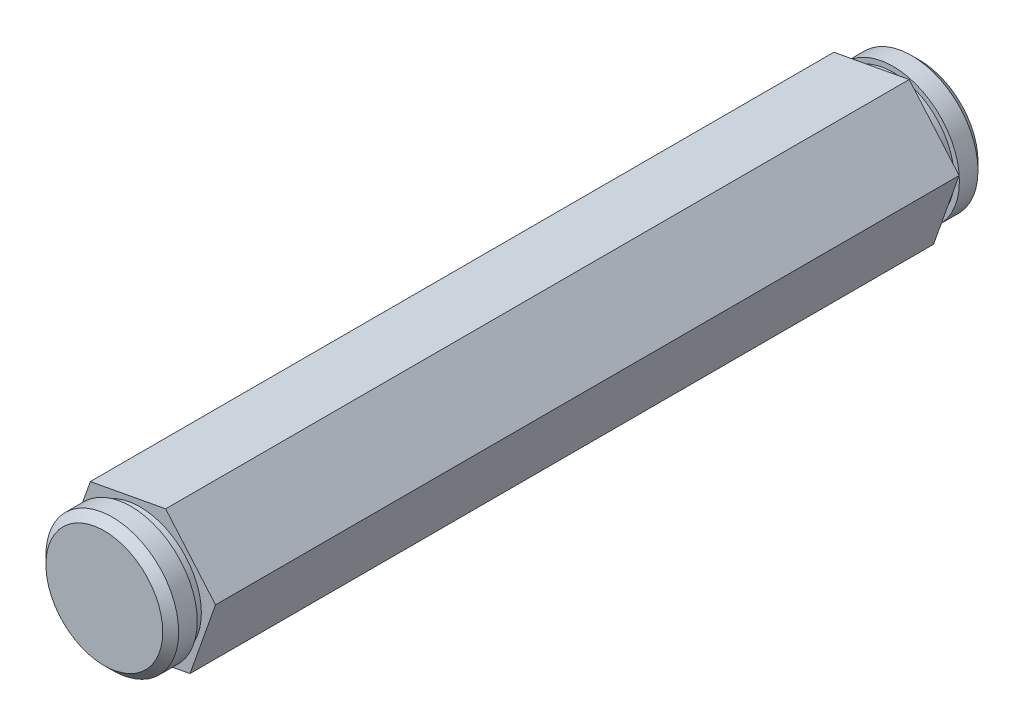
ISO-10303-21;
HEADER;
FILE_DESCRIPTION(('STEP AP214'),'2;1');
FILE_NAME('part.step','',(''),(''),'','','');
FILE_SCHEMA(('AUTOMOTIVE_DESIGN { 1 0 10303 214 1 1 1 1 }'));
ENDSEC;
DATA;
#1=APPLICATION_CONTEXT('core data for automotive mechanical design processes');
#2=APPLICATION_PROTOCOL_DEFINITION('international standard','automotive_design',2000,#1);
#3=PRODUCT_CONTEXT('',#1,'mechanical');
#4=PRODUCT('Part','Part','',(#3));
#5=PRODUCT_RELATED_PRODUCT_CATEGORY('part','',(#4));
#6=PRODUCT_DEFINITION_FORMATION('','',#4);
#7=PRODUCT_DEFINITION_CONTEXT('part definition',#1,'design');
#8=PRODUCT_DEFINITION('design','',#6,#7);
#9=PRODUCT_DEFINITION_SHAPE('','',#8);
#10=(LENGTH_UNIT() NAMED_UNIT(*) SI_UNIT(.MILLI.,.METRE.));
#11=(NAMED_UNIT(*) PLANE_ANGLE_UNIT() SI_UNIT($,.RADIAN.));
#12=(NAMED_UNIT(*) SI_UNIT($,.STERADIAN.) SOLID_ANGLE_UNIT());
#13=UNCERTAINTY_MEASURE_WITH_UNIT(LENGTH_MEASURE(1.E-05),#10,'distance_accuracy_value','');
#14=(GEOMETRIC_REPRESENTATION_CONTEXT(3) GLOBAL_UNCERTAINTY_ASSIGNED_CONTEXT((#13)) GLOBAL_UNIT_ASSIGNED_CONTEXT((#10,
#11,#12)) REPRESENTATION_CONTEXT('',''));
#15=CARTESIAN_POINT('',(0.,0.,0.));
#16=DIRECTION('',(0.,0.,1.));
#17=DIRECTION('',(1.,0.,0.));
#18=AXIS2_PLACEMENT_3D('',#15,#16,#17);
#19=CARTESIAN_POINT('',(0.,0.,35.56));
#20=DIRECTION('',(0.,0.,1.));
#21=DIRECTION('',(1.,0.,0.));
#22=AXIS2_PLACEMENT_3D('',#19,#20,#21);
#23=PLANE('',#22);
#24=DIRECTION('',(0.650243525538385,-0.759725843640593,0.));
#25=VECTOR('',#24,1.);
#26=CARTESIAN_POINT('',(-7.20816515024612,-1.3437590930338,35.56));
#27=LINE('',#26,#25);
#28=CARTESIAN_POINT('',(-7.20816515024612,-1.3437590930338,35.56));
#29=VERTEX_POINT('',#28);
#30=CARTESIAN_POINT('',(-2.44035306398947,-6.91433368130369,35.56));
#31=VERTEX_POINT('',#30);
#32=EDGE_CURVE('E130',#29,#31,#27,.T.);
#33=ORIENTED_EDGE('',*,*,#32,.T.);
#34=DIRECTION('',(0.983063643273511,0.183264489942301,0.));
#35=VECTOR('',#34,1.);
#36=CARTESIAN_POINT('',(-2.44035306398947,-6.91433368130369,35.56));
#37=LINE('',#36,#35);
#38=CARTESIAN_POINT('',(4.76781208625663,-5.57057458826989,35.56));
#39=VERTEX_POINT('',#38);
#40=EDGE_CURVE('E88',#31,#39,#37,.T.);
#41=ORIENTED_EDGE('',*,*,#40,.T.);
#42=DIRECTION('',(0.332820117735126,0.942990333582894,0.));
#43=VECTOR('',#42,1.);
#44=CARTESIAN_POINT('',(4.76781208625663,-5.57057458826989,35.56));
#45=LINE('',#44,#43);
#46=CARTESIAN_POINT('',(7.20816515024607,1.3437590930338,35.56));
#47=VERTEX_POINT('',#46);
#48=EDGE_CURVE('E101',#39,#47,#45,.T.);
#49=ORIENTED_EDGE('',*,*,#48,.T.);
#50=DIRECTION('',(-0.650243525538385,0.759725843640593,0.));
#51=VECTOR('',#50,1.);
#52=CARTESIAN_POINT('',(7.20816515024607,1.3437590930338,35.56));
#53=LINE('',#52,#51);
#54=CARTESIAN_POINT('',(2.44035306398941,6.9143336813037,35.56));
#55=VERTEX_POINT('',#54);
#56=EDGE_CURVE('E95',#47,#55,#53,.T.);
#57=ORIENTED_EDGE('',*,*,#56,.T.);
#58=DIRECTION('',(-0.983063643273511,-0.1832644899423,0.));
#59=VECTOR('',#58,1.);
#60=CARTESIAN_POINT('',(2.44035306398941,6.9143336813037,35.56));
#61=LINE('',#60,#59);
#62=CARTESIAN_POINT('',(-4.76781208625668,5.5705745882699,35.56));
#63=VERTEX_POINT('',#62);
#64=EDGE_CURVE('E99',#55,#63,#61,.T.);
#65=ORIENTED_EDGE('',*,*,#64,.T.);
#66=DIRECTION('',(-0.332820117735125,-0.942990333582894,0.));
#67=VECTOR('',#66,1.);
#68=CARTESIAN_POINT('',(-4.76781208625668,5.5705745882699,35.56));
#69=LINE('',#68,#67);
#70=EDGE_CURVE('E50',#63,#29,#69,.T.);
#71=ORIENTED_EDGE('',*,*,#70,.T.);
#72=EDGE_LOOP('',(#33,#41,#49,#57,#65,#71));
#73=FACE_BOUND('',#72,.T.);
#74=CARTESIAN_POINT('',(0.,0.,35.56));
#75=DIRECTION('',(0.,0.,1.));
#76=DIRECTION('',(1.,0.,0.));
#77=AXIS2_PLACEMENT_3D('',#74,#75,#76);
#78=CIRCLE('',#77,5.8547);
#79=CARTESIAN_POINT('',(5.8547,0.,35.56));
#80=VERTEX_POINT('',#79);
#81=EDGE_CURVE('E214',#80,#80,#78,.T.);
#82=ORIENTED_EDGE('',*,*,#81,.F.);
#83=EDGE_LOOP('',(#82));
#84=FACE_BOUND('',#83,.T.);
#85=ADVANCED_FACE('F33',(#73,#84),#23,.T.);
#86=CARTESIAN_POINT('',(-7.20816515024612,-1.3437590930338,35.56));
#87=DIRECTION('',(0.759725843640593,0.650243525538385,0.));
#88=DIRECTION('',(-0.650243525538385,0.759725843640593,0.));
#89=AXIS2_PLACEMENT_3D('',#86,#87,#88);
#90=PLANE('',#89);
#91=DIRECTION('',(0.650243525538385,-0.759725843640593,0.));
#92=VECTOR('',#91,1.);
#93=CARTESIAN_POINT('',(-7.20816515024612,-1.3437590930338,-35.56));
#94=LINE('',#93,#92);
#95=CARTESIAN_POINT('',(-7.20816515024612,-1.3437590930338,-35.56));
#96=VERTEX_POINT('',#95);
#97=CARTESIAN_POINT('',(-2.44035306398947,-6.91433368130369,-35.56));
#98=VERTEX_POINT('',#97);
#99=EDGE_CURVE('E119',#96,#98,#94,.T.);
#100=ORIENTED_EDGE('',*,*,#99,.T.);
#101=DIRECTION('',(0.,0.,-1.));
#102=VECTOR('',#101,1.);
#103=CARTESIAN_POINT('',(-2.44035306398947,-6.91433368130369,35.56));
#104=LINE('',#103,#102);
#105=EDGE_CURVE('E137',#31,#98,#104,.T.);
#106=ORIENTED_EDGE('',*,*,#105,.F.);
#107=ORIENTED_EDGE('',*,*,#32,.F.);
#108=DIRECTION('',(0.,0.,-1.));
#109=VECTOR('',#108,1.);
#110=CARTESIAN_POINT('',(-7.20816515024612,-1.3437590930338,35.56));
#111=LINE('',#110,#109);
#112=EDGE_CURVE('E115',#29,#96,#111,.T.);
#113=ORIENTED_EDGE('',*,*,#112,.T.);
#114=EDGE_LOOP('',(#100,#106,#107,#113));
#115=FACE_BOUND('',#114,.T.);
#116=ADVANCED_FACE('F161',(#115),#90,.F.);
#117=CARTESIAN_POINT('',(-2.44035306398947,-6.91433368130369,35.56));
#118=DIRECTION('',(-0.183264489942301,0.983063643273511,0.));
#119=DIRECTION('',(-0.983063643273511,-0.183264489942301,0.));
#120=AXIS2_PLACEMENT_3D('',#117,#118,#119);
#121=PLANE('',#120);
#122=DIRECTION('',(0.983063643273511,0.183264489942301,0.));
#123=VECTOR('',#122,1.);
#124=CARTESIAN_POINT('',(-2.44035306398947,-6.91433368130369,-35.56));
#125=LINE('',#124,#123);
#126=CARTESIAN_POINT('',(4.76781208625663,-5.57057458826989,-35.56));
#127=VERTEX_POINT('',#126);
#128=EDGE_CURVE('E122',#98,#127,#125,.T.);
#129=ORIENTED_EDGE('',*,*,#128,.T.);
#130=DIRECTION('',(0.,0.,-1.));
#131=VECTOR('',#130,1.);
#132=CARTESIAN_POINT('',(4.76781208625663,-5.57057458826989,35.56));
#133=LINE('',#132,#131);
#134=EDGE_CURVE('E134',#39,#127,#133,.T.);
#135=ORIENTED_EDGE('',*,*,#134,.F.);
#136=ORIENTED_EDGE('',*,*,#40,.F.);
#137=ORIENTED_EDGE('',*,*,#105,.T.);
#138=EDGE_LOOP('',(#129,#135,#136,#137));
#139=FACE_BOUND('',#138,.T.);
#140=ADVANCED_FACE('F166',(#139),#121,.F.);
#141=CARTESIAN_POINT('',(4.76781208625663,-5.57057458826989,35.56));
#142=DIRECTION('',(-0.942990333582893,0.332820117735126,0.));
#143=DIRECTION('',(-0.332820117735126,-0.942990333582894,0.));
#144=AXIS2_PLACEMENT_3D('',#141,#142,#143);
#145=PLANE('',#144);
#146=DIRECTION('',(0.332820117735126,0.942990333582894,0.));
#147=VECTOR('',#146,1.);
#148=CARTESIAN_POINT('',(4.76781208625663,-5.57057458826989,-35.56));
#149=LINE('',#148,#147);
#150=CARTESIAN_POINT('',(7.20816515024607,1.3437590930338,-35.56));
#151=VERTEX_POINT('',#150);
#152=EDGE_CURVE('E125',#127,#151,#149,.T.);
#153=ORIENTED_EDGE('',*,*,#152,.T.);
#154=DIRECTION('',(0.,0.,-1.));
#155=VECTOR('',#154,1.);
#156=CARTESIAN_POINT('',(7.20816515024607,1.3437590930338,35.56));
#157=LINE('',#156,#155);
#158=EDGE_CURVE('E110',#47,#151,#157,.T.);
#159=ORIENTED_EDGE('',*,*,#158,.F.);
#160=ORIENTED_EDGE('',*,*,#48,.F.);
#161=ORIENTED_EDGE('',*,*,#134,.T.);
#162=EDGE_LOOP('',(#153,#159,#160,#161));
#163=FACE_BOUND('',#162,.T.);
#164=ADVANCED_FACE('F184',(#163),#145,.F.);
#165=CARTESIAN_POINT('',(7.20816515024607,1.3437590930338,35.56));
#166=DIRECTION('',(-0.759725843640593,-0.650243525538385,0.));
#167=DIRECTION('',(0.650243525538385,-0.759725843640593,0.));
#168=AXIS2_PLACEMENT_3D('',#165,#166,#167);
#169=PLANE('',#168);
#170=DIRECTION('',(-0.650243525538385,0.759725843640593,0.));
#171=VECTOR('',#170,1.);
#172=CARTESIAN_POINT('',(7.20816515024607,1.3437590930338,-35.56));
#173=LINE('',#172,#171);
#174=CARTESIAN_POINT('',(2.44035306398941,6.9143336813037,-35.56));
#175=VERTEX_POINT('',#174);
#176=EDGE_CURVE('E109',#151,#175,#173,.T.);
#177=ORIENTED_EDGE('',*,*,#176,.T.);
#178=DIRECTION('',(0.,0.,-1.));
#179=VECTOR('',#178,1.);
#180=CARTESIAN_POINT('',(2.44035306398941,6.9143336813037,35.56));
#181=LINE('',#180,#179);
#182=EDGE_CURVE('E106',#55,#175,#181,.T.);
#183=ORIENTED_EDGE('',*,*,#182,.F.);
#184=ORIENTED_EDGE('',*,*,#56,.F.);
#185=ORIENTED_EDGE('',*,*,#158,.T.);
#186=EDGE_LOOP('',(#177,#183,#184,#185));
#187=FACE_BOUND('',#186,.T.);
#188=ADVANCED_FACE('F107',(#187),#169,.F.);
#189=CARTESIAN_POINT('',(2.44035306398941,6.9143336813037,35.56));
#190=DIRECTION('',(0.1832644899423,-0.983063643273511,0.));
#191=DIRECTION('',(0.983063643273511,0.1832644899423,0.));
#192=AXIS2_PLACEMENT_3D('',#189,#190,#191);
#193=PLANE('',#192);
#194=DIRECTION('',(-0.983063643273511,-0.1832644899423,0.));
#195=VECTOR('',#194,1.);
#196=CARTESIAN_POINT('',(2.44035306398941,6.9143336813037,-35.56));
#197=LINE('',#196,#195);
#198=CARTESIAN_POINT('',(-4.76781208625668,5.5705745882699,-35.56));
#199=VERTEX_POINT('',#198);
#200=EDGE_CURVE('E73',#175,#199,#197,.T.);
#201=ORIENTED_EDGE('',*,*,#200,.T.);
#202=DIRECTION('',(0.,0.,-1.));
#203=VECTOR('',#202,1.);
#204=CARTESIAN_POINT('',(-4.76781208625668,5.5705745882699,35.56));
#205=LINE('',#204,#203);
#206=EDGE_CURVE('E111',#63,#199,#205,.T.);
#207=ORIENTED_EDGE('',*,*,#206,.F.);
#208=ORIENTED_EDGE('',*,*,#64,.F.);
#209=ORIENTED_EDGE('',*,*,#182,.T.);
#210=EDGE_LOOP('',(#201,#207,#208,#209));
#211=FACE_BOUND('',#210,.T.);
#212=ADVANCED_FACE('F113',(#211),#193,.F.);
#213=CARTESIAN_POINT('',(-4.76781208625668,5.5705745882699,35.56));
#214=DIRECTION('',(0.942990333582894,-0.332820117735125,0.));
#215=DIRECTION('',(0.332820117735125,0.942990333582894,0.));
#216=AXIS2_PLACEMENT_3D('',#213,#214,#215);
#217=PLANE('',#216);
#218=DIRECTION('',(-0.332820117735125,-0.942990333582894,0.));
#219=VECTOR('',#218,1.);
#220=CARTESIAN_POINT('',(-4.76781208625668,5.5705745882699,-35.56));
#221=LINE('',#220,#219);
#222=EDGE_CURVE('E79',#199,#96,#221,.T.);
#223=ORIENTED_EDGE('',*,*,#222,.T.);
#224=ORIENTED_EDGE('',*,*,#112,.F.);
#225=ORIENTED_EDGE('',*,*,#70,.F.);
#226=ORIENTED_EDGE('',*,*,#206,.T.);
#227=EDGE_LOOP('',(#223,#224,#225,#226));
#228=FACE_BOUND('',#227,.T.);
#229=ADVANCED_FACE('F176',(#228),#217,.F.);
#230=CARTESIAN_POINT('',(0.,0.,-35.56));
#231=DIRECTION('',(0.,0.,1.));
#232=DIRECTION('',(1.,0.,0.));
#233=AXIS2_PLACEMENT_3D('',#230,#231,#232);
#234=PLANE('',#233);
#235=CARTESIAN_POINT('',(0.,0.,-35.56));
#236=DIRECTION('',(0.,0.,1.));
#237=DIRECTION('',(1.,0.,0.));
#238=AXIS2_PLACEMENT_3D('',#235,#236,#237);
#239=CIRCLE('',#238,5.8547);
#240=CARTESIAN_POINT('',(5.8547,0.,-35.56));
#241=VERTEX_POINT('',#240);
#242=EDGE_CURVE('E215',#241,#241,#239,.T.);
#243=ORIENTED_EDGE('',*,*,#242,.T.);
#244=EDGE_LOOP('',(#243));
#245=FACE_BOUND('',#244,.T.);
#246=ORIENTED_EDGE('',*,*,#99,.F.);
#247=ORIENTED_EDGE('',*,*,#222,.F.);
#248=ORIENTED_EDGE('',*,*,#200,.F.);
#249=ORIENTED_EDGE('',*,*,#176,.F.);
#250=ORIENTED_EDGE('',*,*,#152,.F.);
#251=ORIENTED_EDGE('',*,*,#128,.F.);
#252=EDGE_LOOP('',(#246,#247,#248,#249,#250,#251));
#253=FACE_BOUND('',#252,.T.);
#254=ADVANCED_FACE('F173',(#245,#253),#234,.F.);
#255=CARTESIAN_POINT('',(0.,0.,36.449));
#256=DIRECTION('',(0.,0.,-1.));
#257=DIRECTION('',(-1.,0.,0.));
#258=AXIS2_PLACEMENT_3D('',#255,#256,#257);
#259=CYLINDRICAL_SURFACE('',#258,5.8547);
#260=CARTESIAN_POINT('',(0.,0.,36.449));
#261=DIRECTION('',(0.,0.,1.));
#262=DIRECTION('',(1.,0.,0.));
#263=AXIS2_PLACEMENT_3D('',#260,#261,#262);
#264=CIRCLE('',#263,5.8547);
#265=CARTESIAN_POINT('',(5.8547,0.,36.449));
#266=VERTEX_POINT('',#265);
#267=EDGE_CURVE('E123',#266,#266,#264,.T.);
#268=ORIENTED_EDGE('',*,*,#267,.F.);
#269=EDGE_LOOP('',(#268));
#270=FACE_BOUND('',#269,.T.);
#271=ORIENTED_EDGE('',*,*,#81,.T.);
#272=EDGE_LOOP('',(#271));
#273=FACE_BOUND('',#272,.T.);
#274=ADVANCED_FACE('F171',(#270,#273),#259,.T.);
#275=CARTESIAN_POINT('',(0.,0.,36.449));
#276=DIRECTION('',(0.,0.,1.));
#277=DIRECTION('',(1.,0.,0.));
#278=AXIS2_PLACEMENT_3D('',#275,#276,#277);
#279=PLANE('',#278);
#280=CARTESIAN_POINT('',(0.,0.,36.449));
#281=DIRECTION('',(0.,0.,1.));
#282=DIRECTION('',(1.,0.,0.));
#283=AXIS2_PLACEMENT_3D('',#280,#281,#282);
#284=CIRCLE('',#283,6.35);
#285=CARTESIAN_POINT('',(6.35,0.,36.449));
#286=VERTEX_POINT('',#285);
#287=EDGE_CURVE('E212',#286,#286,#284,.T.);
#288=ORIENTED_EDGE('',*,*,#287,.F.);
#289=EDGE_LOOP('',(#288));
#290=FACE_BOUND('',#289,.T.);
#291=ORIENTED_EDGE('',*,*,#267,.T.);
#292=EDGE_LOOP('',(#291));
#293=FACE_BOUND('',#292,.T.);
#294=ADVANCED_FACE('F209',(#290,#293),#279,.F.);
#295=CARTESIAN_POINT('',(0.,0.,38.989));
#296=DIRECTION('',(0.,0.,-1.));
#297=DIRECTION('',(-1.,0.,0.));
#298=AXIS2_PLACEMENT_3D('',#295,#296,#297);
#299=CYLINDRICAL_SURFACE('',#298,6.35);
#300=CARTESIAN_POINT('',(0.,0.,38.227));
#301=DIRECTION('',(0.,0.,1.));
#302=DIRECTION('',(1.,0.,0.));
#303=AXIS2_PLACEMENT_3D('',#300,#301,#302);
#304=CIRCLE('',#303,6.35);
#305=CARTESIAN_POINT('',(6.35,0.,38.227));
#306=VERTEX_POINT('',#305);
#307=EDGE_CURVE('E142',#306,#306,#304,.F.);
#308=ORIENTED_EDGE('',*,*,#307,.T.);
#309=EDGE_LOOP('',(#308));
#310=FACE_BOUND('',#309,.T.);
#311=ORIENTED_EDGE('',*,*,#287,.T.);
#312=EDGE_LOOP('',(#311));
#313=FACE_BOUND('',#312,.T.);
#314=ADVANCED_FACE('F200',(#310,#313),#299,.T.);
#315=CARTESIAN_POINT('',(0.,0.,38.989));
#316=DIRECTION('',(0.,0.,1.));
#317=DIRECTION('',(1.,0.,0.));
#318=AXIS2_PLACEMENT_3D('',#315,#316,#317);
#319=PLANE('',#318);
#320=CARTESIAN_POINT('',(0.,0.,38.989));
#321=DIRECTION('',(0.,0.,1.));
#322=DIRECTION('',(1.,0.,0.));
#323=AXIS2_PLACEMENT_3D('',#320,#321,#322);
#324=CIRCLE('',#323,5.588);
#325=CARTESIAN_POINT('',(5.588,0.,38.989));
#326=VERTEX_POINT('',#325);
#327=EDGE_CURVE('E139',#326,#326,#324,.T.);
#328=ORIENTED_EDGE('',*,*,#327,.T.);
#329=EDGE_LOOP('',(#328));
#330=FACE_BOUND('',#329,.T.);
#331=ADVANCED_FACE('F192',(#330),#319,.T.);
#332=CARTESIAN_POINT('',(0.,0.,38.989));
#333=DIRECTION('',(0.,0.,-1.));
#334=DIRECTION('',(-1.,0.,0.));
#335=AXIS2_PLACEMENT_3D('',#332,#333,#334);
#336=CONICAL_SURFACE('',#335,5.588,0.785398163397447);
#337=ORIENTED_EDGE('',*,*,#307,.F.);
#338=EDGE_LOOP('',(#337));
#339=FACE_BOUND('',#338,.T.);
#340=ORIENTED_EDGE('',*,*,#327,.F.);
#341=EDGE_LOOP('',(#340));
#342=FACE_BOUND('',#341,.T.);
#343=ADVANCED_FACE('F189',(#339,#342),#336,.T.);
#344=CARTESIAN_POINT('',(0.,0.,-36.449));
#345=DIRECTION('',(0.,0.,1.));
#346=DIRECTION('',(1.,0.,0.));
#347=AXIS2_PLACEMENT_3D('',#344,#345,#346);
#348=CYLINDRICAL_SURFACE('',#347,5.8547);
#349=CARTESIAN_POINT('',(0.,0.,-36.449));
#350=DIRECTION('',(0.,0.,-1.));
#351=DIRECTION('',(-1.,0.,0.));
#352=AXIS2_PLACEMENT_3D('',#349,#350,#351);
#353=CIRCLE('',#352,5.8547);
#354=CARTESIAN_POINT('',(-5.8547,0.,-36.449));
#355=VERTEX_POINT('',#354);
#356=EDGE_CURVE('E220',#355,#355,#353,.F.);
#357=ORIENTED_EDGE('',*,*,#356,.T.);
#358=EDGE_LOOP('',(#357));
#359=FACE_BOUND('',#358,.T.);
#360=ORIENTED_EDGE('',*,*,#242,.F.);
#361=EDGE_LOOP('',(#360));
#362=FACE_BOUND('',#361,.T.);
#363=ADVANCED_FACE('F191',(#359,#362),#348,.T.);
#364=CARTESIAN_POINT('',(0.,0.,-38.989));
#365=DIRECTION('',(0.,0.,1.));
#366=DIRECTION('',(1.,0.,0.));
#367=AXIS2_PLACEMENT_3D('',#364,#365,#366);
#368=CYLINDRICAL_SURFACE('',#367,6.35);
#369=CARTESIAN_POINT('',(0.,0.,-38.227));
#370=DIRECTION('',(0.,0.,-1.));
#371=DIRECTION('',(-1.,0.,0.));
#372=AXIS2_PLACEMENT_3D('',#369,#370,#371);
#373=CIRCLE('',#372,6.35);
#374=CARTESIAN_POINT('',(6.35,0.,-38.227));
#375=VERTEX_POINT('',#374);
#376=EDGE_CURVE('E42',#375,#375,#373,.F.);
#377=ORIENTED_EDGE('',*,*,#376,.T.);
#378=EDGE_LOOP('',(#377));
#379=FACE_BOUND('',#378,.T.);
#380=CARTESIAN_POINT('',(0.,0.,-36.449));
#381=DIRECTION('',(0.,0.,1.));
#382=DIRECTION('',(1.,0.,0.));
#383=AXIS2_PLACEMENT_3D('',#380,#381,#382);
#384=CIRCLE('',#383,6.35);
#385=CARTESIAN_POINT('',(6.35,0.,-36.449));
#386=VERTEX_POINT('',#385);
#387=EDGE_CURVE('E349',#386,#386,#384,.T.);
#388=ORIENTED_EDGE('',*,*,#387,.F.);
#389=EDGE_LOOP('',(#388));
#390=FACE_BOUND('',#389,.T.);
#391=ADVANCED_FACE('F147',(#379,#390),#368,.T.);
#392=CARTESIAN_POINT('',(0.,0.,-38.989));
#393=DIRECTION('',(0.,0.,-1.));
#394=DIRECTION('',(1.,0.,0.));
#395=AXIS2_PLACEMENT_3D('',#392,#393,#394);
#396=PLANE('',#395);
#397=CARTESIAN_POINT('',(0.,0.,-38.989));
#398=DIRECTION('',(0.,0.,-1.));
#399=DIRECTION('',(-1.,0.,0.));
#400=AXIS2_PLACEMENT_3D('',#397,#398,#399);
#401=CIRCLE('',#400,5.58799999999999);
#402=CARTESIAN_POINT('',(5.588,0.,-38.989));
#403=VERTEX_POINT('',#402);
#404=EDGE_CURVE('E11',#403,#403,#401,.T.);
#405=ORIENTED_EDGE('',*,*,#404,.T.);
#406=EDGE_LOOP('',(#405));
#407=FACE_BOUND('',#406,.T.);
#408=ADVANCED_FACE('F156',(#407),#396,.T.);
#409=CARTESIAN_POINT('',(0.,0.,-36.449));
#410=DIRECTION('',(0.,0.,-1.));
#411=DIRECTION('',(1.,0.,0.));
#412=AXIS2_PLACEMENT_3D('',#409,#410,#411);
#413=PLANE('',#412);
#414=ORIENTED_EDGE('',*,*,#356,.F.);
#415=EDGE_LOOP('',(#414));
#416=FACE_BOUND('',#415,.T.);
#417=ORIENTED_EDGE('',*,*,#387,.T.);
#418=EDGE_LOOP('',(#417));
#419=FACE_BOUND('',#418,.T.);
#420=ADVANCED_FACE('F151',(#416,#419),#413,.F.);
#421=CARTESIAN_POINT('',(0.,0.,-38.227));
#422=DIRECTION('',(0.,0.,1.));
#423=DIRECTION('',(1.,0.,0.));
#424=AXIS2_PLACEMENT_3D('',#421,#422,#423);
#425=CONICAL_SURFACE('',#424,6.35,0.785398163397444);
#426=CARTESIAN_POINT('',(5.588,0.,-38.989));
#427=CARTESIAN_POINT('',(5.5959375,0.,-38.9810625));
#428=CARTESIAN_POINT('',(5.603875,0.,-38.973125));
#429=CARTESIAN_POINT('',(5.61975,0.,-38.95725));
#430=CARTESIAN_POINT('',(5.6276875,0.,-38.9493125));
#431=CARTESIAN_POINT('',(5.6435625,0.,-38.9334375));
#432=CARTESIAN_POINT('',(5.6515,0.,-38.9255));
#433=CARTESIAN_POINT('',(5.667375,0.,-38.909625));
#434=CARTESIAN_POINT('',(5.6753125,0.,-38.9016875));
#435=CARTESIAN_POINT('',(5.6911875,0.,-38.8858125));
#436=CARTESIAN_POINT('',(5.699125,0.,-38.877875));
#437=CARTESIAN_POINT('',(5.715,0.,-38.862));
#438=CARTESIAN_POINT('',(5.7229375,0.,-38.8540625));
#439=CARTESIAN_POINT('',(5.7388125,0.,-38.8381875));
#440=CARTESIAN_POINT('',(5.74675,0.,-38.83025));
#441=CARTESIAN_POINT('',(5.762625,0.,-38.814375));
#442=CARTESIAN_POINT('',(5.7705625,0.,-38.8064375));
#443=CARTESIAN_POINT('',(5.7864375,0.,-38.7905625));
#444=CARTESIAN_POINT('',(5.794375,0.,-38.782625));
#445=CARTESIAN_POINT('',(5.81025,0.,-38.76675));
#446=CARTESIAN_POINT('',(5.8181875,0.,-38.7588125));
#447=CARTESIAN_POINT('',(5.8340625,0.,-38.7429375));
#448=CARTESIAN_POINT('',(5.842,0.,-38.735));
#449=CARTESIAN_POINT('',(5.857875,0.,-38.719125));
#450=CARTESIAN_POINT('',(5.8658125,0.,-38.7111875));
#451=CARTESIAN_POINT('',(5.8816875,0.,-38.6953125));
#452=CARTESIAN_POINT('',(5.889625,0.,-38.687375));
#453=CARTESIAN_POINT('',(5.9055,0.,-38.6715));
#454=CARTESIAN_POINT('',(5.9134375,0.,-38.6635625));
#455=CARTESIAN_POINT('',(5.9293125,0.,-38.6476875));
#456=CARTESIAN_POINT('',(5.93725,0.,-38.63975));
#457=CARTESIAN_POINT('',(5.953125,0.,-38.623875));
#458=CARTESIAN_POINT('',(5.9610625,0.,-38.6159375));
#459=CARTESIAN_POINT('',(5.9769375,0.,-38.6000625));
#460=CARTESIAN_POINT('',(5.984875,0.,-38.592125));
#461=CARTESIAN_POINT('',(6.00075,0.,-38.57625));
#462=CARTESIAN_POINT('',(6.0086875,0.,-38.5683125));
#463=CARTESIAN_POINT('',(6.0245625,0.,-38.5524375));
#464=CARTESIAN_POINT('',(6.0325,0.,-38.5445));
#465=CARTESIAN_POINT('',(6.048375,0.,-38.528625));
#466=CARTESIAN_POINT('',(6.0563125,0.,-38.5206875));
#467=CARTESIAN_POINT('',(6.0721875,0.,-38.5048125));
#468=CARTESIAN_POINT('',(6.080125,0.,-38.496875));
#469=CARTESIAN_POINT('',(6.096,0.,-38.481));
#470=CARTESIAN_POINT('',(6.1039375,0.,-38.4730625));
#471=CARTESIAN_POINT('',(6.1198125,0.,-38.4571875));
#472=CARTESIAN_POINT('',(6.12775,0.,-38.44925));
#473=CARTESIAN_POINT('',(6.143625,0.,-38.433375));
#474=CARTESIAN_POINT('',(6.1515625,0.,-38.4254375));
#475=CARTESIAN_POINT('',(6.1674375,0.,-38.4095625));
#476=CARTESIAN_POINT('',(6.175375,0.,-38.401625));
#477=CARTESIAN_POINT('',(6.19125,0.,-38.38575));
#478=CARTESIAN_POINT('',(6.1991875,0.,-38.3778125));
#479=CARTESIAN_POINT('',(6.2150625,0.,-38.3619375));
#480=CARTESIAN_POINT('',(6.223,0.,-38.354));
#481=CARTESIAN_POINT('',(6.238875,0.,-38.338125));
#482=CARTESIAN_POINT('',(6.2468125,0.,-38.3301875));
#483=CARTESIAN_POINT('',(6.2626875,0.,-38.3143125));
#484=CARTESIAN_POINT('',(6.270625,0.,-38.306375));
#485=CARTESIAN_POINT('',(6.2865,0.,-38.2905));
#486=CARTESIAN_POINT('',(6.2944375,0.,-38.2825625));
#487=CARTESIAN_POINT('',(6.3103125,0.,-38.2666875));
#488=CARTESIAN_POINT('',(6.31825,0.,-38.25875));
#489=CARTESIAN_POINT('',(6.334125,0.,-38.242875));
#490=CARTESIAN_POINT('',(6.3420625,0.,-38.2349375));
#491=CARTESIAN_POINT('',(6.35,0.,-38.227));
#492=B_SPLINE_CURVE_WITH_KNOTS('',3,(#426,#427,#428,#429,#430,#431,#432,#433,#434,#435,#436,
#437,#438,#439,#440,#441,#442,#443,#444,#445,#446,#447,#448,#449,#450,#451,#452,#453,#454,#455,
#456,#457,#458,#459,#460,#461,#462,#463,#464,#465,#466,#467,#468,#469,#470,#471,#472,#473,#474,
#475,#476,#477,#478,#479,#480,#481,#482,#483,#484,#485,#486,#487,#488,#489,#490,#491),
.UNSPECIFIED.,.F.,.F.,(4,2,2,2,2,2,2,2,2,2,2,2,2,2,2,2,2,2,2,2,2,2,2,2,2,2,2,2,2,2,2,2,4),(0.,
0.033675960454008,0.0673519209080161,0.101027881362028,0.134703841816036,0.168379802270045,
0.202055762724057,0.235731723178065,0.269407683632078,0.303083644086086,0.336759604540094,
0.370435564994106,0.404111525448114,0.437787485902122,0.471463446356135,0.505139406810143,
0.538815367264156,0.572491327718164,0.606167288172172,0.639843248626184,0.673519209080192,
0.7071951695342,0.740871129988212,0.774547090442221,0.808223050896233,0.841899011350241,
0.87557497180425,0.909250932258262,0.94292689271227,0.976602853166278,1.01027881362029,
1.0439547740743,1.07763073452831),.UNSPECIFIED.);
#493=EDGE_CURVE('BSEAM35',#403,#375,#492,.T.);
#494=ORIENTED_EDGE('',*,*,#404,.F.);
#495=ORIENTED_EDGE('',*,*,#376,.F.);
#496=ORIENTED_EDGE('',*,*,#493,.T.);
#497=ORIENTED_EDGE('',*,*,#493,.F.);
#498=EDGE_LOOP('',(#494,#496,#495,#497));
#499=FACE_BOUND('',#498,.T.);
#500=ADVANCED_FACE('F35',(#499),#425,.T.);
#501=CLOSED_SHELL('',(#85,#116,#140,#164,#188,#212,#229,#254,#274,#294,#314,#331,#343,#363,#391,
#408,#420,#500));
#502=MANIFOLD_SOLID_BREP('B2',#501);
#503=ADVANCED_BREP_SHAPE_REPRESENTATION('',(#18,#502),#14);
#504=SHAPE_DEFINITION_REPRESENTATION(#9,#503);
ENDSEC;
END-ISO-10303-21;
